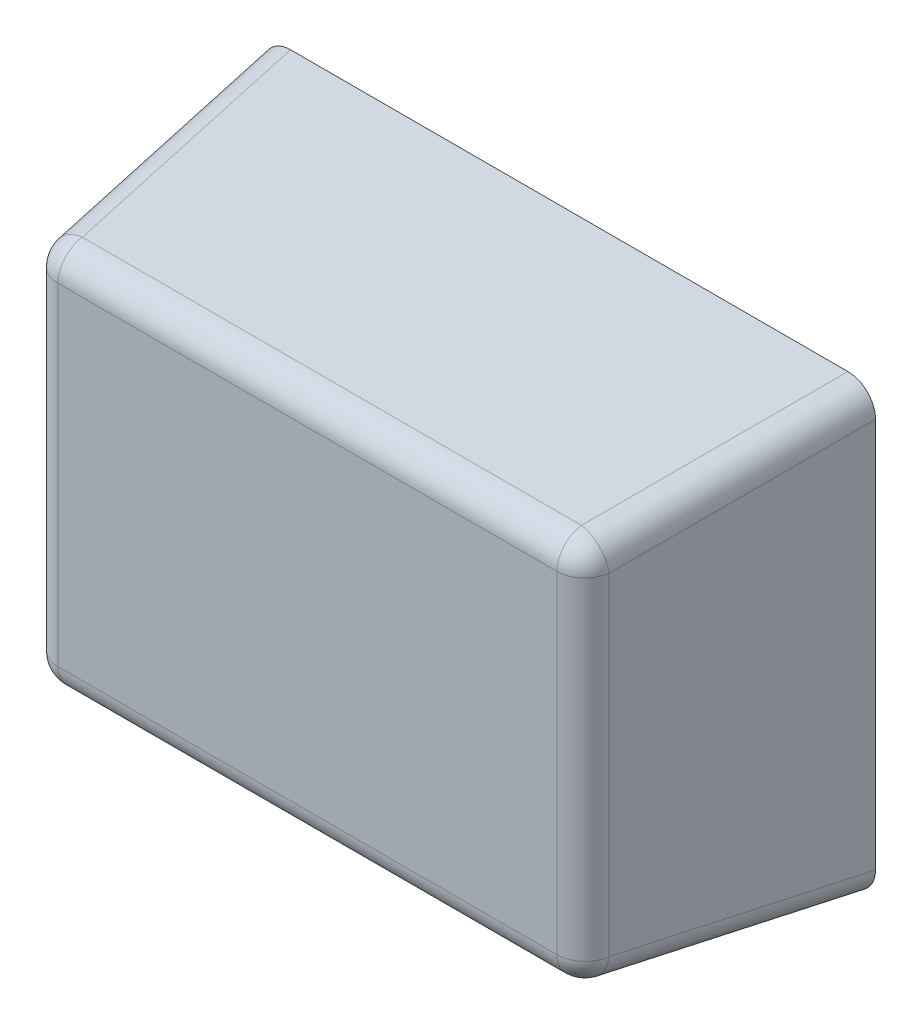
ISO-10303-21;
HEADER;
FILE_DESCRIPTION(('STEP AP214'),'2;1');
FILE_NAME('part.step','',(''),(''),'','','');
FILE_SCHEMA(('AUTOMOTIVE_DESIGN { 1 0 10303 214 1 1 1 1 }'));
ENDSEC;
DATA;
#1=APPLICATION_CONTEXT('core data for automotive mechanical design processes');
#2=APPLICATION_PROTOCOL_DEFINITION('international standard','automotive_design',2000,#1);
#3=PRODUCT_CONTEXT('',#1,'mechanical');
#4=PRODUCT('Part','Part','',(#3));
#5=PRODUCT_RELATED_PRODUCT_CATEGORY('part','',(#4));
#6=PRODUCT_DEFINITION_FORMATION('','',#4);
#7=PRODUCT_DEFINITION_CONTEXT('part definition',#1,'design');
#8=PRODUCT_DEFINITION('design','',#6,#7);
#9=PRODUCT_DEFINITION_SHAPE('','',#8);
#10=(LENGTH_UNIT() NAMED_UNIT(*) SI_UNIT(.MILLI.,.METRE.));
#11=(NAMED_UNIT(*) PLANE_ANGLE_UNIT() SI_UNIT($,.RADIAN.));
#12=(NAMED_UNIT(*) SI_UNIT($,.STERADIAN.) SOLID_ANGLE_UNIT());
#13=UNCERTAINTY_MEASURE_WITH_UNIT(LENGTH_MEASURE(1.E-05),#10,'distance_accuracy_value','');
#14=(GEOMETRIC_REPRESENTATION_CONTEXT(3) GLOBAL_UNCERTAINTY_ASSIGNED_CONTEXT((#13)) GLOBAL_UNIT_ASSIGNED_CONTEXT((#10,
#11,#12)) REPRESENTATION_CONTEXT('',''));
#15=CARTESIAN_POINT('',(0.,0.,0.));
#16=DIRECTION('',(0.,0.,1.));
#17=DIRECTION('',(1.,0.,0.));
#18=AXIS2_PLACEMENT_3D('',#15,#16,#17);
#19=CARTESIAN_POINT('',(0.460085822129,-0.310085822129,0.502016760958));
#20=DIRECTION('',(-0.120974291151512,0.120974291151512,0.985256536015254));
#21=DIRECTION('',(0.696681577824754,-0.696681577824754,0.171083483244939));
#22=AXIS2_PLACEMENT_3D('',#19,#20,#21);
#23=CYLINDRICAL_SURFACE('',#22,0.05);
#24=CARTESIAN_POINT('',(0.448054993148,-0.298054993148,0.6));
#25=DIRECTION('',(-0.120974291151512,0.120974291151512,0.985256536015254));
#26=DIRECTION('',(0.696681577824754,-0.696681577824754,0.171083483244939));
#27=AXIS2_PLACEMENT_3D('',#24,#25,#26);
#28=CIRCLE('',#27,0.05);
#29=CARTESIAN_POINT('',(0.448054993148,-0.34768230073,0.60609346717));
#30=VERTEX_POINT('',#29);
#31=CARTESIAN_POINT('',(0.49768230073,-0.298054993148,0.60609346717));
#32=VERTEX_POINT('',#31);
#33=EDGE_CURVE('E127',#30,#32,#28,.T.);
#34=ORIENTED_EDGE('',*,*,#33,.F.);
#35=DIRECTION('',(0.120974291151045,-0.120974291151045,-0.985256536015369));
#36=VECTOR('',#35,1.);
#37=CARTESIAN_POINT('',(0.460085822129,-0.359713129711,0.508110228128));
#38=LINE('',#37,#36);
#39=CARTESIAN_POINT('',(0.500372692418,-0.4,0.18));
#40=VERTEX_POINT('',#39);
#41=EDGE_CURVE('E11',#30,#40,#38,.T.);
#42=ORIENTED_EDGE('',*,*,#41,.T.);
#43=CARTESIAN_POINT('',(0.499624508727,-0.349624508727,0.18));
#44=DIRECTION('',(0.,0.,1.));
#45=DIRECTION('',(0.707106781186548,-0.707106781186548,0.));
#46=AXIS2_PLACEMENT_3D('',#43,#44,#45);
#47=ELLIPSE('',#46,0.05074820432272,0.05);
#48=CARTESIAN_POINT('',(0.55,-0.350372692418,0.18));
#49=VERTEX_POINT('',#48);
#50=EDGE_CURVE('E216',#40,#49,#47,.T.);
#51=ORIENTED_EDGE('',*,*,#50,.T.);
#52=DIRECTION('',(-0.120974291151045,0.120974291151045,0.985256536015369));
#53=VECTOR('',#52,1.);
#54=CARTESIAN_POINT('',(0.509713129711,-0.310085822129,0.508110228128));
#55=LINE('',#54,#53);
#56=EDGE_CURVE('E129',#49,#32,#55,.T.);
#57=ORIENTED_EDGE('',*,*,#56,.T.);
#58=EDGE_LOOP('',(#34,#42,#51,#57));
#59=FACE_BOUND('',#58,.T.);
#60=ADVANCED_FACE('F17',(#59),#23,.T.);
#61=CARTESIAN_POINT('',(-0.4,-0.371145628188,0.415));
#62=DIRECTION('',(0.,-0.992546151641335,0.121869343405041));
#63=DIRECTION('',(-1.,0.,0.));
#64=AXIS2_PLACEMENT_3D('',#61,#62,#63);
#65=PLANE('',#64);
#66=DIRECTION('',(1.,0.,0.));
#67=VECTOR('',#66,1.);
#68=CARTESIAN_POINT('',(-0.2,-0.34768230073,0.60609346717));
#69=LINE('',#68,#67);
#70=CARTESIAN_POINT('',(-0.448054993148,-0.34768230073,0.60609346717));
#71=VERTEX_POINT('',#70);
#72=EDGE_CURVE('E120',#71,#30,#69,.T.);
#73=ORIENTED_EDGE('',*,*,#72,.F.);
#74=DIRECTION('',(0.120974291151045,0.120974291151045,0.985256536015369));
#75=VECTOR('',#74,1.);
#76=CARTESIAN_POINT('',(-0.471344903004,-0.370972210586,0.416412373024));
#77=LINE('',#76,#75);
#78=CARTESIAN_POINT('',(-0.500372692418,-0.4,0.18));
#79=VERTEX_POINT('',#78);
#80=EDGE_CURVE('E26',#79,#71,#77,.T.);
#81=ORIENTED_EDGE('',*,*,#80,.F.);
#82=DIRECTION('',(1.,0.,0.));
#83=VECTOR('',#82,1.);
#84=CARTESIAN_POINT('',(-0.4,-0.4,0.18));
#85=LINE('',#84,#83);
#86=EDGE_CURVE('E123',#79,#40,#85,.T.);
#87=ORIENTED_EDGE('',*,*,#86,.T.);
#88=ORIENTED_EDGE('',*,*,#41,.F.);
#89=EDGE_LOOP('',(#73,#81,#87,#88));
#90=FACE_BOUND('',#89,.T.);
#91=ADVANCED_FACE('F118',(#90),#65,.T.);
#92=CARTESIAN_POINT('',(-0.471344903004,-0.321344903004,0.410318905853));
#93=DIRECTION('',(-0.120974291151512,-0.120974291151512,-0.985256536015254));
#94=DIRECTION('',(-0.696681577824754,-0.696681577824754,0.171083483244939));
#95=AXIS2_PLACEMENT_3D('',#92,#93,#94);
#96=CYLINDRICAL_SURFACE('',#95,0.05);
#97=CARTESIAN_POINT('',(-0.448054993148,-0.298054993148,0.6));
#98=DIRECTION('',(0.120974291151512,0.120974291151512,0.985256536015254));
#99=DIRECTION('',(-0.696681577824754,-0.696681577824754,0.171083483244939));
#100=AXIS2_PLACEMENT_3D('',#97,#98,#99);
#101=CIRCLE('',#100,0.05);
#102=CARTESIAN_POINT('',(-0.49768230073,-0.298054993148,0.60609346717));
#103=VERTEX_POINT('',#102);
#104=EDGE_CURVE('E191',#103,#71,#101,.T.);
#105=ORIENTED_EDGE('',*,*,#104,.F.);
#106=DIRECTION('',(-0.120974291151045,-0.120974291151045,-0.985256536015369));
#107=VECTOR('',#106,1.);
#108=CARTESIAN_POINT('',(-0.520972210586,-0.321344903004,0.416412373024));
#109=LINE('',#108,#107);
#110=CARTESIAN_POINT('',(-0.55,-0.350372692418,0.18));
#111=VERTEX_POINT('',#110);
#112=EDGE_CURVE('E20',#103,#111,#109,.T.);
#113=ORIENTED_EDGE('',*,*,#112,.T.);
#114=CARTESIAN_POINT('',(-0.499624508727,-0.349624508727,0.18));
#115=DIRECTION('',(0.,0.,1.));
#116=DIRECTION('',(-0.707106781186548,-0.707106781186548,0.));
#117=AXIS2_PLACEMENT_3D('',#114,#115,#116);
#118=ELLIPSE('',#117,0.05074820432272,0.05);
#119=EDGE_CURVE('E225',#111,#79,#118,.T.);
#120=ORIENTED_EDGE('',*,*,#119,.T.);
#121=ORIENTED_EDGE('',*,*,#80,.T.);
#122=EDGE_LOOP('',(#105,#113,#120,#121));
#123=FACE_BOUND('',#122,.T.);
#124=ADVANCED_FACE('F434',(#123),#96,.T.);
#125=CARTESIAN_POINT('',(-0.521145628188,-0.369337260425,0.415));
#126=DIRECTION('',(-0.992546151641335,0.,0.121869343405041));
#127=DIRECTION('',(0.,1.,0.));
#128=AXIS2_PLACEMENT_3D('',#125,#126,#127);
#129=PLANE('',#128);
#130=DIRECTION('',(0.,-1.,0.));
#131=VECTOR('',#130,1.);
#132=CARTESIAN_POINT('',(-0.49768230073,-0.184668630212,0.60609346717));
#133=LINE('',#132,#131);
#134=CARTESIAN_POINT('',(-0.49768230073,0.298054993148,0.60609346717));
#135=VERTEX_POINT('',#134);
#136=EDGE_CURVE('E187',#135,#103,#133,.T.);
#137=ORIENTED_EDGE('',*,*,#136,.F.);
#138=DIRECTION('',(0.120974291151045,-0.120974291151045,0.985256536015369));
#139=VECTOR('',#138,1.);
#140=CARTESIAN_POINT('',(-0.509713129711,0.310085822129,0.508110228128));
#141=LINE('',#140,#139);
#142=CARTESIAN_POINT('',(-0.55,0.350372692418,0.18));
#143=VERTEX_POINT('',#142);
#144=EDGE_CURVE('E233',#143,#135,#141,.T.);
#145=ORIENTED_EDGE('',*,*,#144,.F.);
#146=DIRECTION('',(0.,-1.,0.));
#147=VECTOR('',#146,1.);
#148=CARTESIAN_POINT('',(-0.55,-0.369337260425,0.18));
#149=LINE('',#148,#147);
#150=EDGE_CURVE('E254',#143,#111,#149,.T.);
#151=ORIENTED_EDGE('',*,*,#150,.T.);
#152=ORIENTED_EDGE('',*,*,#112,.F.);
#153=EDGE_LOOP('',(#137,#145,#151,#152));
#154=FACE_BOUND('',#153,.T.);
#155=ADVANCED_FACE('F424',(#154),#129,.T.);
#156=CARTESIAN_POINT('',(0.,0.,0.18));
#157=DIRECTION('',(0.,0.,-1.));
#158=DIRECTION('',(0.,-1.,0.));
#159=AXIS2_PLACEMENT_3D('',#156,#157,#158);
#160=PLANE('',#159);
#161=CARTESIAN_POINT('',(0.499624508727,0.349624508727,0.18));
#162=DIRECTION('',(0.,0.,1.));
#163=DIRECTION('',(0.707106781186548,0.707106781186548,0.));
#164=AXIS2_PLACEMENT_3D('',#161,#162,#163);
#165=ELLIPSE('',#164,0.05074820432272,0.05);
#166=CARTESIAN_POINT('',(0.55,0.350372692418,0.18));
#167=VERTEX_POINT('',#166);
#168=CARTESIAN_POINT('',(0.500372692418,0.4,0.18));
#169=VERTEX_POINT('',#168);
#170=EDGE_CURVE('E246',#167,#169,#165,.T.);
#171=ORIENTED_EDGE('',*,*,#170,.F.);
#172=DIRECTION('',(0.,1.,0.));
#173=VECTOR('',#172,1.);
#174=CARTESIAN_POINT('',(0.55,0.369337260425,0.18));
#175=LINE('',#174,#173);
#176=EDGE_CURVE('E219',#49,#167,#175,.T.);
#177=ORIENTED_EDGE('',*,*,#176,.F.);
#178=ORIENTED_EDGE('',*,*,#50,.F.);
#179=ORIENTED_EDGE('',*,*,#86,.F.);
#180=ORIENTED_EDGE('',*,*,#119,.F.);
#181=ORIENTED_EDGE('',*,*,#150,.F.);
#182=CARTESIAN_POINT('',(-0.499624508727,0.349624508727,0.18));
#183=DIRECTION('',(0.,0.,1.));
#184=DIRECTION('',(-0.707106781186548,0.707106781186548,0.));
#185=AXIS2_PLACEMENT_3D('',#182,#183,#184);
#186=ELLIPSE('',#185,0.05074820432272,0.05);
#187=CARTESIAN_POINT('',(-0.500372692418,0.4,0.18));
#188=VERTEX_POINT('',#187);
#189=EDGE_CURVE('E229',#188,#143,#186,.T.);
#190=ORIENTED_EDGE('',*,*,#189,.F.);
#191=DIRECTION('',(-1.,0.,0.));
#192=VECTOR('',#191,1.);
#193=CARTESIAN_POINT('',(0.4,0.4,0.18));
#194=LINE('',#193,#192);
#195=EDGE_CURVE('E239',#169,#188,#194,.T.);
#196=ORIENTED_EDGE('',*,*,#195,.F.);
#197=EDGE_LOOP('',(#171,#177,#178,#179,#180,#181,#190,#196));
#198=FACE_BOUND('',#197,.T.);
#199=ADVANCED_FACE('F413',(#198),#160,.T.);
#200=CARTESIAN_POINT('',(0.,0.,0.65));
#201=DIRECTION('',(0.,0.,1.));
#202=DIRECTION('',(1.,0.,0.));
#203=AXIS2_PLACEMENT_3D('',#200,#201,#202);
#204=PLANE('',#203);
#205=DIRECTION('',(-1.,0.,0.));
#206=VECTOR('',#205,1.);
#207=CARTESIAN_POINT('',(-0.2,-0.298054993148,0.65));
#208=LINE('',#207,#206);
#209=CARTESIAN_POINT('',(0.448054993148,-0.298054993148,0.65));
#210=VERTEX_POINT('',#209);
#211=CARTESIAN_POINT('',(-0.448054993148,-0.298054993148,0.65));
#212=VERTEX_POINT('',#211);
#213=EDGE_CURVE('E152',#210,#212,#208,.T.);
#214=ORIENTED_EDGE('',*,*,#213,.F.);
#215=DIRECTION('',(0.,-1.,0.));
#216=VECTOR('',#215,1.);
#217=CARTESIAN_POINT('',(0.448054993148,0.184668630212,0.65));
#218=LINE('',#217,#216);
#219=CARTESIAN_POINT('',(0.448054993148,0.298054993148,0.65));
#220=VERTEX_POINT('',#219);
#221=EDGE_CURVE('E165',#220,#210,#218,.T.);
#222=ORIENTED_EDGE('',*,*,#221,.F.);
#223=DIRECTION('',(1.,0.,0.));
#224=VECTOR('',#223,1.);
#225=CARTESIAN_POINT('',(0.2,0.298054993148,0.65));
#226=LINE('',#225,#224);
#227=CARTESIAN_POINT('',(-0.448054993148,0.298054993148,0.65));
#228=VERTEX_POINT('',#227);
#229=EDGE_CURVE('E170',#228,#220,#226,.T.);
#230=ORIENTED_EDGE('',*,*,#229,.F.);
#231=DIRECTION('',(0.,1.,0.));
#232=VECTOR('',#231,1.);
#233=CARTESIAN_POINT('',(-0.448054993148,-0.184668630212,0.65));
#234=LINE('',#233,#232);
#235=EDGE_CURVE('E179',#212,#228,#234,.T.);
#236=ORIENTED_EDGE('',*,*,#235,.F.);
#237=EDGE_LOOP('',(#214,#222,#230,#236));
#238=FACE_BOUND('',#237,.T.);
#239=ADVANCED_FACE('F402',(#238),#204,.T.);
#240=CARTESIAN_POINT('',(0.521145628188,0.369337260425,0.415));
#241=DIRECTION('',(0.992546151641335,0.,0.121869343405041));
#242=DIRECTION('',(0.,-1.,0.));
#243=AXIS2_PLACEMENT_3D('',#240,#241,#242);
#244=PLANE('',#243);
#245=DIRECTION('',(0.,1.,0.));
#246=VECTOR('',#245,1.);
#247=CARTESIAN_POINT('',(0.49768230073,0.184668630212,0.60609346717));
#248=LINE('',#247,#246);
#249=CARTESIAN_POINT('',(0.49768230073,0.298054993148,0.60609346717));
#250=VERTEX_POINT('',#249);
#251=EDGE_CURVE('E200',#32,#250,#248,.T.);
#252=ORIENTED_EDGE('',*,*,#251,.F.);
#253=ORIENTED_EDGE('',*,*,#56,.F.);
#254=ORIENTED_EDGE('',*,*,#176,.T.);
#255=DIRECTION('',(0.120974291151045,0.120974291151045,-0.985256536015369));
#256=VECTOR('',#255,1.);
#257=CARTESIAN_POINT('',(0.520972210586,0.321344903004,0.416412373024));
#258=LINE('',#257,#256);
#259=EDGE_CURVE('E242',#250,#167,#258,.T.);
#260=ORIENTED_EDGE('',*,*,#259,.F.);
#261=EDGE_LOOP('',(#252,#253,#254,#260));
#262=FACE_BOUND('',#261,.T.);
#263=ADVANCED_FACE('F392',(#262),#244,.T.);
#264=CARTESIAN_POINT('',(0.471344903004,0.321344903004,0.410318905853));
#265=DIRECTION('',(0.120974291151512,0.120974291151512,-0.985256536015254));
#266=DIRECTION('',(0.696681577824754,0.696681577824754,0.171083483244939));
#267=AXIS2_PLACEMENT_3D('',#264,#265,#266);
#268=CYLINDRICAL_SURFACE('',#267,0.05);
#269=CARTESIAN_POINT('',(0.448054993148,0.298054993148,0.6));
#270=DIRECTION('',(-0.120974291151512,-0.120974291151512,0.985256536015254));
#271=DIRECTION('',(0.696681577824754,0.696681577824754,0.171083483244939));
#272=AXIS2_PLACEMENT_3D('',#269,#270,#271);
#273=CIRCLE('',#272,0.05);
#274=CARTESIAN_POINT('',(0.448054993148,0.34768230073,0.60609346717));
#275=VERTEX_POINT('',#274);
#276=EDGE_CURVE('E135',#250,#275,#273,.T.);
#277=ORIENTED_EDGE('',*,*,#276,.F.);
#278=ORIENTED_EDGE('',*,*,#259,.T.);
#279=ORIENTED_EDGE('',*,*,#170,.T.);
#280=DIRECTION('',(-0.120974291151045,-0.120974291151045,0.985256536015369));
#281=VECTOR('',#280,1.);
#282=CARTESIAN_POINT('',(0.471344903004,0.370972210586,0.416412373024));
#283=LINE('',#282,#281);
#284=EDGE_CURVE('E236',#169,#275,#283,.T.);
#285=ORIENTED_EDGE('',*,*,#284,.T.);
#286=EDGE_LOOP('',(#277,#278,#279,#285));
#287=FACE_BOUND('',#286,.T.);
#288=ADVANCED_FACE('F381',(#287),#268,.T.);
#289=CARTESIAN_POINT('',(0.4,0.371145628188,0.415));
#290=DIRECTION('',(0.,0.992546151641335,0.121869343405041));
#291=DIRECTION('',(1.,0.,0.));
#292=AXIS2_PLACEMENT_3D('',#289,#290,#291);
#293=PLANE('',#292);
#294=DIRECTION('',(-1.,0.,0.));
#295=VECTOR('',#294,1.);
#296=CARTESIAN_POINT('',(0.2,0.34768230073,0.60609346717));
#297=LINE('',#296,#295);
#298=CARTESIAN_POINT('',(-0.448054993148,0.34768230073,0.60609346717));
#299=VERTEX_POINT('',#298);
#300=EDGE_CURVE('E207',#275,#299,#297,.T.);
#301=ORIENTED_EDGE('',*,*,#300,.F.);
#302=ORIENTED_EDGE('',*,*,#284,.F.);
#303=ORIENTED_EDGE('',*,*,#195,.T.);
#304=DIRECTION('',(-0.120974291151045,0.120974291151045,-0.985256536015369));
#305=VECTOR('',#304,1.);
#306=CARTESIAN_POINT('',(-0.460085822129,0.359713129711,0.508110228128));
#307=LINE('',#306,#305);
#308=EDGE_CURVE('E134',#299,#188,#307,.T.);
#309=ORIENTED_EDGE('',*,*,#308,.F.);
#310=EDGE_LOOP('',(#301,#302,#303,#309));
#311=FACE_BOUND('',#310,.T.);
#312=ADVANCED_FACE('F370',(#311),#293,.T.);
#313=CARTESIAN_POINT('',(-0.460085822129,0.310085822129,0.502016760958));
#314=DIRECTION('',(0.120974291151512,-0.120974291151512,0.985256536015254));
#315=DIRECTION('',(-0.696681577824754,0.696681577824754,0.171083483244939));
#316=AXIS2_PLACEMENT_3D('',#313,#314,#315);
#317=CYLINDRICAL_SURFACE('',#316,0.05);
#318=CARTESIAN_POINT('',(-0.448054993148,0.298054993148,0.6));
#319=DIRECTION('',(0.120974291151512,-0.120974291151512,0.985256536015254));
#320=DIRECTION('',(-0.696681577824754,0.696681577824754,0.171083483244939));
#321=AXIS2_PLACEMENT_3D('',#318,#319,#320);
#322=CIRCLE('',#321,0.05);
#323=EDGE_CURVE('E166',#299,#135,#322,.T.);
#324=ORIENTED_EDGE('',*,*,#323,.F.);
#325=ORIENTED_EDGE('',*,*,#308,.T.);
#326=ORIENTED_EDGE('',*,*,#189,.T.);
#327=ORIENTED_EDGE('',*,*,#144,.T.);
#328=EDGE_LOOP('',(#324,#325,#326,#327));
#329=FACE_BOUND('',#328,.T.);
#330=ADVANCED_FACE('F360',(#329),#317,.T.);
#331=CARTESIAN_POINT('',(0.448054993148,-0.298054993148,0.6));
#332=DIRECTION('',(-0.330118051054026,-0.848471675492066,-0.413663979887032));
#333=DIRECTION('',(0.529240791972383,-0.529240791972383,0.66318049445448));
#334=AXIS2_PLACEMENT_3D('',#331,#332,#333);
#335=SPHERICAL_SURFACE('',#334,0.05);
#336=CARTESIAN_POINT('',(0.448054993148,-0.298054993148,0.6));
#337=DIRECTION('',(-1.,0.,0.));
#338=DIRECTION('',(0.,-0.992546151641335,0.121869343405041));
#339=AXIS2_PLACEMENT_3D('',#336,#337,#338);
#340=CIRCLE('',#339,0.05);
#341=EDGE_CURVE('E141',#30,#210,#340,.T.);
#342=ORIENTED_EDGE('',*,*,#341,.F.);
#343=ORIENTED_EDGE('',*,*,#33,.T.);
#344=CARTESIAN_POINT('',(0.448054993148,-0.298054993148,0.6));
#345=DIRECTION('',(0.,1.,0.));
#346=DIRECTION('',(0.,0.,1.));
#347=AXIS2_PLACEMENT_3D('',#344,#345,#346);
#348=CIRCLE('',#347,0.05);
#349=EDGE_CURVE('E149',#210,#32,#348,.T.);
#350=ORIENTED_EDGE('',*,*,#349,.F.);
#351=EDGE_LOOP('',(#342,#343,#350));
#352=FACE_BOUND('',#351,.T.);
#353=ADVANCED_FACE('F147',(#352),#335,.T.);
#354=CARTESIAN_POINT('',(0.448054993148,0.298054993148,0.6));
#355=DIRECTION('',(0.330118051054026,-0.848471675492066,0.413663979887032));
#356=DIRECTION('',(0.529240791972383,0.529240791972383,0.66318049445448));
#357=AXIS2_PLACEMENT_3D('',#354,#355,#356);
#358=SPHERICAL_SURFACE('',#357,0.05);
#359=CARTESIAN_POINT('',(0.448054993148,0.298054993148,0.6));
#360=DIRECTION('',(0.,-1.,0.));
#361=DIRECTION('',(0.992546151641335,0.,0.121869343405041));
#362=AXIS2_PLACEMENT_3D('',#359,#360,#361);
#363=CIRCLE('',#362,0.05);
#364=EDGE_CURVE('E162',#250,#220,#363,.T.);
#365=ORIENTED_EDGE('',*,*,#364,.F.);
#366=ORIENTED_EDGE('',*,*,#276,.T.);
#367=CARTESIAN_POINT('',(0.448054993148,0.298054993148,0.6));
#368=DIRECTION('',(-1.,0.,0.));
#369=DIRECTION('',(0.,0.,1.));
#370=AXIS2_PLACEMENT_3D('',#367,#368,#369);
#371=CIRCLE('',#370,0.05);
#372=EDGE_CURVE('E174',#220,#275,#371,.T.);
#373=ORIENTED_EDGE('',*,*,#372,.F.);
#374=EDGE_LOOP('',(#365,#366,#373));
#375=FACE_BOUND('',#374,.T.);
#376=ADVANCED_FACE('F337',(#375),#358,.T.);
#377=CARTESIAN_POINT('',(0.448054993148,0.184668630212,0.6));
#378=DIRECTION('',(0.,-1.,0.));
#379=DIRECTION('',(0.662620048215886,0.,0.748955720788871));
#380=AXIS2_PLACEMENT_3D('',#377,#378,#379);
#381=CYLINDRICAL_SURFACE('',#380,0.05);
#382=ORIENTED_EDGE('',*,*,#364,.T.);
#383=ORIENTED_EDGE('',*,*,#221,.T.);
#384=ORIENTED_EDGE('',*,*,#349,.T.);
#385=ORIENTED_EDGE('',*,*,#251,.T.);
#386=EDGE_LOOP('',(#382,#383,#384,#385));
#387=FACE_BOUND('',#386,.T.);
#388=ADVANCED_FACE('F326',(#387),#381,.T.);
#389=CARTESIAN_POINT('',(-0.448054993148,0.298054993148,0.6));
#390=DIRECTION('',(-0.330118051054026,-0.848471675492066,0.413663979887032));
#391=DIRECTION('',(-0.529240791972383,0.529240791972383,0.66318049445448));
#392=AXIS2_PLACEMENT_3D('',#389,#390,#391);
#393=SPHERICAL_SURFACE('',#392,0.05);
#394=CARTESIAN_POINT('',(-0.448054993148,0.298054993148,0.6));
#395=DIRECTION('',(1.,0.,0.));
#396=DIRECTION('',(0.,0.992546151641335,0.121869343405041));
#397=AXIS2_PLACEMENT_3D('',#394,#395,#396);
#398=CIRCLE('',#397,0.05);
#399=EDGE_CURVE('E175',#299,#228,#398,.T.);
#400=ORIENTED_EDGE('',*,*,#399,.F.);
#401=ORIENTED_EDGE('',*,*,#323,.T.);
#402=CARTESIAN_POINT('',(-0.448054993148,0.298054993148,0.6));
#403=DIRECTION('',(0.,-1.,0.));
#404=DIRECTION('',(0.,0.,1.));
#405=AXIS2_PLACEMENT_3D('',#402,#403,#404);
#406=CIRCLE('',#405,0.05);
#407=EDGE_CURVE('E183',#228,#135,#406,.T.);
#408=ORIENTED_EDGE('',*,*,#407,.F.);
#409=EDGE_LOOP('',(#400,#401,#408));
#410=FACE_BOUND('',#409,.T.);
#411=ADVANCED_FACE('F315',(#410),#393,.T.);
#412=CARTESIAN_POINT('',(0.2,0.298054993148,0.6));
#413=DIRECTION('',(1.,0.,0.));
#414=DIRECTION('',(0.,0.662620048215886,0.748955720788871));
#415=AXIS2_PLACEMENT_3D('',#412,#413,#414);
#416=CYLINDRICAL_SURFACE('',#415,0.05);
#417=ORIENTED_EDGE('',*,*,#399,.T.);
#418=ORIENTED_EDGE('',*,*,#229,.T.);
#419=ORIENTED_EDGE('',*,*,#372,.T.);
#420=ORIENTED_EDGE('',*,*,#300,.T.);
#421=EDGE_LOOP('',(#417,#418,#419,#420));
#422=FACE_BOUND('',#421,.T.);
#423=ADVANCED_FACE('F303',(#422),#416,.T.);
#424=CARTESIAN_POINT('',(-0.448054993148,-0.298054993148,0.6));
#425=DIRECTION('',(0.330118051054026,-0.848471675492066,-0.413663979887032));
#426=DIRECTION('',(-0.529240791972383,-0.529240791972383,0.66318049445448));
#427=AXIS2_PLACEMENT_3D('',#424,#425,#426);
#428=SPHERICAL_SURFACE('',#427,0.05);
#429=CARTESIAN_POINT('',(-0.448054993148,-0.298054993148,0.6));
#430=DIRECTION('',(0.,1.,0.));
#431=DIRECTION('',(-0.992546151641335,0.,0.121869343405041));
#432=AXIS2_PLACEMENT_3D('',#429,#430,#431);
#433=CIRCLE('',#432,0.05);
#434=EDGE_CURVE('E145',#103,#212,#433,.T.);
#435=ORIENTED_EDGE('',*,*,#434,.F.);
#436=ORIENTED_EDGE('',*,*,#104,.T.);
#437=CARTESIAN_POINT('',(-0.448054993148,-0.298054993148,0.6));
#438=DIRECTION('',(1.,0.,0.));
#439=DIRECTION('',(0.,0.,1.));
#440=AXIS2_PLACEMENT_3D('',#437,#438,#439);
#441=CIRCLE('',#440,0.05);
#442=EDGE_CURVE('E143',#212,#71,#441,.T.);
#443=ORIENTED_EDGE('',*,*,#442,.F.);
#444=EDGE_LOOP('',(#435,#436,#443));
#445=FACE_BOUND('',#444,.T.);
#446=ADVANCED_FACE('F292',(#445),#428,.T.);
#447=CARTESIAN_POINT('',(-0.448054993148,-0.184668630212,0.6));
#448=DIRECTION('',(0.,1.,0.));
#449=DIRECTION('',(-0.662620048215886,0.,0.748955720788871));
#450=AXIS2_PLACEMENT_3D('',#447,#448,#449);
#451=CYLINDRICAL_SURFACE('',#450,0.05);
#452=ORIENTED_EDGE('',*,*,#434,.T.);
#453=ORIENTED_EDGE('',*,*,#235,.T.);
#454=ORIENTED_EDGE('',*,*,#407,.T.);
#455=ORIENTED_EDGE('',*,*,#136,.T.);
#456=EDGE_LOOP('',(#452,#453,#454,#455));
#457=FACE_BOUND('',#456,.T.);
#458=ADVANCED_FACE('F281',(#457),#451,.T.);
#459=CARTESIAN_POINT('',(-0.2,-0.298054993148,0.6));
#460=DIRECTION('',(-1.,0.,0.));
#461=DIRECTION('',(0.,-0.662620048215886,0.748955720788871));
#462=AXIS2_PLACEMENT_3D('',#459,#460,#461);
#463=CYLINDRICAL_SURFACE('',#462,0.05);
#464=ORIENTED_EDGE('',*,*,#341,.T.);
#465=ORIENTED_EDGE('',*,*,#213,.T.);
#466=ORIENTED_EDGE('',*,*,#442,.T.);
#467=ORIENTED_EDGE('',*,*,#72,.T.);
#468=EDGE_LOOP('',(#464,#465,#466,#467));
#469=FACE_BOUND('',#468,.T.);
#470=ADVANCED_FACE('F139',(#469),#463,.T.);
#471=CLOSED_SHELL('',(#60,#91,#124,#155,#199,#239,#263,#288,#312,#330,#353,#376,#388,#411,#423,
#446,#458,#470));
#472=MANIFOLD_SOLID_BREP('B1',#471);
#473=ADVANCED_BREP_SHAPE_REPRESENTATION('',(#18,#472),#14);
#474=SHAPE_DEFINITION_REPRESENTATION(#9,#473);
ENDSEC;
END-ISO-10303-21;
